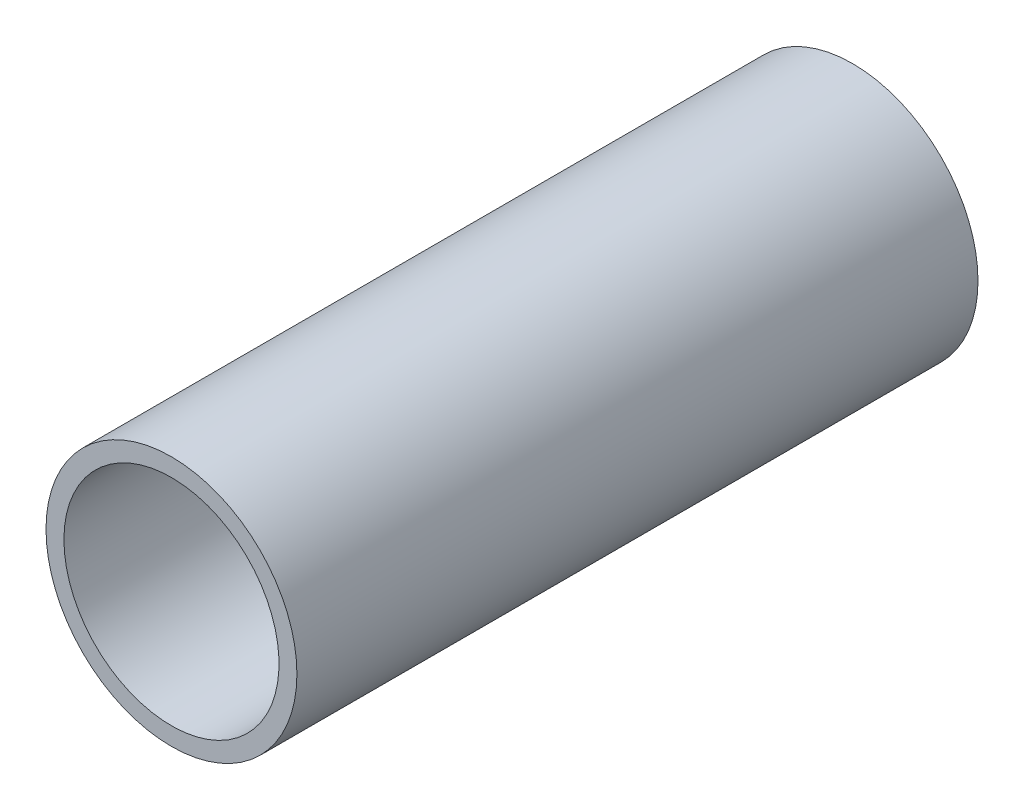
ISO-10303-21;
HEADER;
FILE_DESCRIPTION(('STEP AP214'),'2;1');
FILE_NAME('part.step','',(''),(''),'','','');
FILE_SCHEMA(('AUTOMOTIVE_DESIGN { 1 0 10303 214 1 1 1 1 }'));
ENDSEC;
DATA;
#1=APPLICATION_CONTEXT('core data for automotive mechanical design processes');
#2=APPLICATION_PROTOCOL_DEFINITION('international standard','automotive_design',2000,#1);
#3=PRODUCT_CONTEXT('',#1,'mechanical');
#4=PRODUCT('Part','Part','',(#3));
#5=PRODUCT_RELATED_PRODUCT_CATEGORY('part','',(#4));
#6=PRODUCT_DEFINITION_FORMATION('','',#4);
#7=PRODUCT_DEFINITION_CONTEXT('part definition',#1,'design');
#8=PRODUCT_DEFINITION('design','',#6,#7);
#9=PRODUCT_DEFINITION_SHAPE('','',#8);
#10=(LENGTH_UNIT() NAMED_UNIT(*) SI_UNIT(.MILLI.,.METRE.));
#11=(NAMED_UNIT(*) PLANE_ANGLE_UNIT() SI_UNIT($,.RADIAN.));
#12=(NAMED_UNIT(*) SI_UNIT($,.STERADIAN.) SOLID_ANGLE_UNIT());
#13=UNCERTAINTY_MEASURE_WITH_UNIT(LENGTH_MEASURE(1.E-05),#10,'distance_accuracy_value','');
#14=(GEOMETRIC_REPRESENTATION_CONTEXT(3) GLOBAL_UNCERTAINTY_ASSIGNED_CONTEXT((#13)) GLOBAL_UNIT_ASSIGNED_CONTEXT((#10,
#11,#12)) REPRESENTATION_CONTEXT('',''));
#15=CARTESIAN_POINT('',(0.,0.,0.));
#16=DIRECTION('',(0.,0.,1.));
#17=DIRECTION('',(1.,0.,0.));
#18=AXIS2_PLACEMENT_3D('',#15,#16,#17);
#19=CARTESIAN_POINT('',(0.,0.,30.1625));
#20=DIRECTION('',(0.,0.,1.));
#21=DIRECTION('',(1.,0.,0.));
#22=AXIS2_PLACEMENT_3D('',#19,#20,#21);
#23=PLANE('',#22);
#24=CARTESIAN_POINT('',(0.,0.,30.1625));
#25=DIRECTION('',(0.,0.,1.));
#26=DIRECTION('',(1.,0.,0.));
#27=AXIS2_PLACEMENT_3D('',#24,#25,#26);
#28=CIRCLE('',#27,5.55625);
#29=CARTESIAN_POINT('',(-5.55625,0.,30.1625));
#30=VERTEX_POINT('',#29);
#31=EDGE_CURVE('E10',#30,#30,#28,.T.);
#32=ORIENTED_EDGE('',*,*,#31,.T.);
#33=EDGE_LOOP('',(#32));
#34=FACE_BOUND('',#33,.T.);
#35=CARTESIAN_POINT('',(0.,0.,30.1625));
#36=DIRECTION('',(0.,0.,1.));
#37=DIRECTION('',(1.,0.,0.));
#38=AXIS2_PLACEMENT_3D('',#35,#36,#37);
#39=CIRCLE('',#38,4.7625);
#40=CARTESIAN_POINT('',(-4.7625,0.,30.1625));
#41=VERTEX_POINT('',#40);
#42=EDGE_CURVE('E56',#41,#41,#39,.T.);
#43=ORIENTED_EDGE('',*,*,#42,.F.);
#44=EDGE_LOOP('',(#43));
#45=FACE_BOUND('',#44,.T.);
#46=ADVANCED_FACE('F43',(#34,#45),#23,.T.);
#47=CARTESIAN_POINT('',(0.,0.,0.));
#48=DIRECTION('',(0.,0.,1.));
#49=DIRECTION('',(1.,0.,0.));
#50=AXIS2_PLACEMENT_3D('',#47,#48,#49);
#51=PLANE('',#50);
#52=CARTESIAN_POINT('',(0.,0.,0.));
#53=DIRECTION('',(0.,0.,1.));
#54=DIRECTION('',(1.,0.,0.));
#55=AXIS2_PLACEMENT_3D('',#52,#53,#54);
#56=CIRCLE('',#55,5.55625);
#57=CARTESIAN_POINT('',(-5.55625,0.,0.));
#58=VERTEX_POINT('',#57);
#59=EDGE_CURVE('E47',#58,#58,#56,.T.);
#60=ORIENTED_EDGE('',*,*,#59,.F.);
#61=EDGE_LOOP('',(#60));
#62=FACE_BOUND('',#61,.T.);
#63=CARTESIAN_POINT('',(0.,0.,0.));
#64=DIRECTION('',(0.,0.,1.));
#65=DIRECTION('',(1.,0.,0.));
#66=AXIS2_PLACEMENT_3D('',#63,#64,#65);
#67=CIRCLE('',#66,4.7625);
#68=CARTESIAN_POINT('',(-4.7625,0.,0.));
#69=VERTEX_POINT('',#68);
#70=EDGE_CURVE('E58',#69,#69,#67,.T.);
#71=ORIENTED_EDGE('',*,*,#70,.T.);
#72=EDGE_LOOP('',(#71));
#73=FACE_BOUND('',#72,.T.);
#74=ADVANCED_FACE('F70',(#62,#73),#51,.F.);
#75=CARTESIAN_POINT('',(0.,0.,30.1625));
#76=DIRECTION('',(0.,0.,-1.));
#77=DIRECTION('',(-1.,0.,0.));
#78=AXIS2_PLACEMENT_3D('',#75,#76,#77);
#79=CYLINDRICAL_SURFACE('',#78,5.55625);
#80=CARTESIAN_POINT('',(-5.55625,0.,30.1625));
#81=CARTESIAN_POINT('',(-5.55625,0.,29.8483072916667));
#82=CARTESIAN_POINT('',(-5.55625,0.,29.5341145833333));
#83=CARTESIAN_POINT('',(-5.55625,0.,28.9057291666667));
#84=CARTESIAN_POINT('',(-5.55625,0.,28.5915364583333));
#85=CARTESIAN_POINT('',(-5.55625,0.,27.9631510416667));
#86=CARTESIAN_POINT('',(-5.55625,0.,27.6489583333333));
#87=CARTESIAN_POINT('',(-5.55625,0.,27.0205729166667));
#88=CARTESIAN_POINT('',(-5.55625,0.,26.7063802083333));
#89=CARTESIAN_POINT('',(-5.55625,0.,26.0779947916667));
#90=CARTESIAN_POINT('',(-5.55625,0.,25.7638020833333));
#91=CARTESIAN_POINT('',(-5.55625,0.,25.1354166666667));
#92=CARTESIAN_POINT('',(-5.55625,0.,24.8212239583333));
#93=CARTESIAN_POINT('',(-5.55625,0.,24.1928385416667));
#94=CARTESIAN_POINT('',(-5.55625,0.,23.8786458333333));
#95=CARTESIAN_POINT('',(-5.55625,0.,23.2502604166667));
#96=CARTESIAN_POINT('',(-5.55625,0.,22.9360677083333));
#97=CARTESIAN_POINT('',(-5.55625,0.,22.3076822916667));
#98=CARTESIAN_POINT('',(-5.55625,0.,21.9934895833333));
#99=CARTESIAN_POINT('',(-5.55625,0.,21.3651041666667));
#100=CARTESIAN_POINT('',(-5.55625,0.,21.0509114583333));
#101=CARTESIAN_POINT('',(-5.55625,0.,20.4225260416667));
#102=CARTESIAN_POINT('',(-5.55625,0.,20.1083333333333));
#103=CARTESIAN_POINT('',(-5.55625,0.,19.4799479166667));
#104=CARTESIAN_POINT('',(-5.55625,0.,19.1657552083333));
#105=CARTESIAN_POINT('',(-5.55625,0.,18.5373697916667));
#106=CARTESIAN_POINT('',(-5.55625,0.,18.2231770833333));
#107=CARTESIAN_POINT('',(-5.55625,0.,17.5947916666667));
#108=CARTESIAN_POINT('',(-5.55625,0.,17.2805989583333));
#109=CARTESIAN_POINT('',(-5.55625,0.,16.6522135416667));
#110=CARTESIAN_POINT('',(-5.55625,0.,16.3380208333333));
#111=CARTESIAN_POINT('',(-5.55625,0.,15.7096354166667));
#112=CARTESIAN_POINT('',(-5.55625,0.,15.3954427083333));
#113=CARTESIAN_POINT('',(-5.55625,0.,14.7670572916667));
#114=CARTESIAN_POINT('',(-5.55625,0.,14.4528645833333));
#115=CARTESIAN_POINT('',(-5.55625,0.,13.8244791666667));
#116=CARTESIAN_POINT('',(-5.55625,0.,13.5102864583333));
#117=CARTESIAN_POINT('',(-5.55625,0.,12.8819010416667));
#118=CARTESIAN_POINT('',(-5.55625,0.,12.5677083333333));
#119=CARTESIAN_POINT('',(-5.55625,0.,11.9393229166667));
#120=CARTESIAN_POINT('',(-5.55625,0.,11.6251302083333));
#121=CARTESIAN_POINT('',(-5.55625,0.,10.9967447916667));
#122=CARTESIAN_POINT('',(-5.55625,0.,10.6825520833333));
#123=CARTESIAN_POINT('',(-5.55625,0.,10.0541666666667));
#124=CARTESIAN_POINT('',(-5.55625,0.,9.73997395833333));
#125=CARTESIAN_POINT('',(-5.55625,0.,9.11158854166667));
#126=CARTESIAN_POINT('',(-5.55625,0.,8.79739583333333));
#127=CARTESIAN_POINT('',(-5.55625,0.,8.16901041666667));
#128=CARTESIAN_POINT('',(-5.55625,0.,7.85481770833333));
#129=CARTESIAN_POINT('',(-5.55625,0.,7.22643229166667));
#130=CARTESIAN_POINT('',(-5.55625,0.,6.91223958333333));
#131=CARTESIAN_POINT('',(-5.55625,0.,6.28385416666667));
#132=CARTESIAN_POINT('',(-5.55625,0.,5.96966145833333));
#133=CARTESIAN_POINT('',(-5.55625,0.,5.34127604166667));
#134=CARTESIAN_POINT('',(-5.55625,0.,5.02708333333333));
#135=CARTESIAN_POINT('',(-5.55625,0.,4.39869791666667));
#136=CARTESIAN_POINT('',(-5.55625,0.,4.08450520833333));
#137=CARTESIAN_POINT('',(-5.55625,0.,3.45611979166667));
#138=CARTESIAN_POINT('',(-5.55625,0.,3.14192708333333));
#139=CARTESIAN_POINT('',(-5.55625,0.,2.51354166666667));
#140=CARTESIAN_POINT('',(-5.55625,0.,2.19934895833333));
#141=CARTESIAN_POINT('',(-5.55625,0.,1.57096354166667));
#142=CARTESIAN_POINT('',(-5.55625,0.,1.25677083333333));
#143=CARTESIAN_POINT('',(-5.55625,0.,0.628385416666666));
#144=CARTESIAN_POINT('',(-5.55625,0.,0.314192708333333));
#145=CARTESIAN_POINT('',(-5.55625,0.,0.));
#146=B_SPLINE_CURVE_WITH_KNOTS('',3,(#80,#81,#82,#83,#84,#85,#86,#87,#88,#89,#90,#91,#92,#93,
#94,#95,#96,#97,#98,#99,#100,#101,#102,#103,#104,#105,#106,#107,#108,#109,#110,#111,#112,#113,
#114,#115,#116,#117,#118,#119,#120,#121,#122,#123,#124,#125,#126,#127,#128,#129,#130,#131,#132,
#133,#134,#135,#136,#137,#138,#139,#140,#141,#142,#143,#144,#145),.UNSPECIFIED.,.F.,.F.,(4,2,2,
2,2,2,2,2,2,2,2,2,2,2,2,2,2,2,2,2,2,2,2,2,2,2,2,2,2,2,2,2,4),(0.,0.942578124999999,1.88515625,
2.827734375,3.7703125,4.712890625,5.65546875,6.598046875,7.540625,8.483203125,9.42578124999999,
10.368359375,11.3109375,12.253515625,13.19609375,14.138671875,15.08125,16.023828125,16.96640625,
17.908984375,18.8515625,19.794140625,20.73671875,21.679296875,22.621875,23.564453125,
24.50703125,25.449609375,26.3921875,27.334765625,28.27734375,29.219921875,30.1625),.UNSPECIFIED.);
#147=EDGE_CURVE('BSEAM45',#30,#58,#146,.T.);
#148=ORIENTED_EDGE('',*,*,#31,.F.);
#149=ORIENTED_EDGE('',*,*,#59,.T.);
#150=ORIENTED_EDGE('',*,*,#147,.T.);
#151=ORIENTED_EDGE('',*,*,#147,.F.);
#152=EDGE_LOOP('',(#148,#150,#149,#151));
#153=FACE_BOUND('',#152,.T.);
#154=ADVANCED_FACE('F45',(#153),#79,.T.);
#155=CARTESIAN_POINT('',(0.,0.,30.1625));
#156=DIRECTION('',(0.,0.,-1.));
#157=DIRECTION('',(-1.,0.,0.));
#158=AXIS2_PLACEMENT_3D('',#155,#156,#157);
#159=CYLINDRICAL_SURFACE('',#158,4.7625);
#160=CARTESIAN_POINT('',(-4.7625,0.,30.1625));
#161=CARTESIAN_POINT('',(-4.7625,0.,29.8483072916667));
#162=CARTESIAN_POINT('',(-4.7625,0.,29.5341145833333));
#163=CARTESIAN_POINT('',(-4.7625,0.,28.9057291666667));
#164=CARTESIAN_POINT('',(-4.7625,0.,28.5915364583333));
#165=CARTESIAN_POINT('',(-4.7625,0.,27.9631510416667));
#166=CARTESIAN_POINT('',(-4.7625,0.,27.6489583333333));
#167=CARTESIAN_POINT('',(-4.7625,0.,27.0205729166667));
#168=CARTESIAN_POINT('',(-4.7625,0.,26.7063802083333));
#169=CARTESIAN_POINT('',(-4.7625,0.,26.0779947916667));
#170=CARTESIAN_POINT('',(-4.7625,0.,25.7638020833333));
#171=CARTESIAN_POINT('',(-4.7625,0.,25.1354166666667));
#172=CARTESIAN_POINT('',(-4.7625,0.,24.8212239583333));
#173=CARTESIAN_POINT('',(-4.7625,0.,24.1928385416667));
#174=CARTESIAN_POINT('',(-4.7625,0.,23.8786458333333));
#175=CARTESIAN_POINT('',(-4.7625,0.,23.2502604166667));
#176=CARTESIAN_POINT('',(-4.7625,0.,22.9360677083333));
#177=CARTESIAN_POINT('',(-4.7625,0.,22.3076822916667));
#178=CARTESIAN_POINT('',(-4.7625,0.,21.9934895833333));
#179=CARTESIAN_POINT('',(-4.7625,0.,21.3651041666667));
#180=CARTESIAN_POINT('',(-4.7625,0.,21.0509114583333));
#181=CARTESIAN_POINT('',(-4.7625,0.,20.4225260416667));
#182=CARTESIAN_POINT('',(-4.7625,0.,20.1083333333333));
#183=CARTESIAN_POINT('',(-4.7625,0.,19.4799479166667));
#184=CARTESIAN_POINT('',(-4.7625,0.,19.1657552083333));
#185=CARTESIAN_POINT('',(-4.7625,0.,18.5373697916667));
#186=CARTESIAN_POINT('',(-4.7625,0.,18.2231770833333));
#187=CARTESIAN_POINT('',(-4.7625,0.,17.5947916666667));
#188=CARTESIAN_POINT('',(-4.7625,0.,17.2805989583333));
#189=CARTESIAN_POINT('',(-4.7625,0.,16.6522135416667));
#190=CARTESIAN_POINT('',(-4.7625,0.,16.3380208333333));
#191=CARTESIAN_POINT('',(-4.7625,0.,15.7096354166667));
#192=CARTESIAN_POINT('',(-4.7625,0.,15.3954427083333));
#193=CARTESIAN_POINT('',(-4.7625,0.,14.7670572916667));
#194=CARTESIAN_POINT('',(-4.7625,0.,14.4528645833333));
#195=CARTESIAN_POINT('',(-4.7625,0.,13.8244791666667));
#196=CARTESIAN_POINT('',(-4.7625,0.,13.5102864583333));
#197=CARTESIAN_POINT('',(-4.7625,0.,12.8819010416667));
#198=CARTESIAN_POINT('',(-4.7625,0.,12.5677083333333));
#199=CARTESIAN_POINT('',(-4.7625,0.,11.9393229166667));
#200=CARTESIAN_POINT('',(-4.7625,0.,11.6251302083333));
#201=CARTESIAN_POINT('',(-4.7625,0.,10.9967447916667));
#202=CARTESIAN_POINT('',(-4.7625,0.,10.6825520833333));
#203=CARTESIAN_POINT('',(-4.7625,0.,10.0541666666667));
#204=CARTESIAN_POINT('',(-4.7625,0.,9.73997395833333));
#205=CARTESIAN_POINT('',(-4.7625,0.,9.11158854166667));
#206=CARTESIAN_POINT('',(-4.7625,0.,8.79739583333333));
#207=CARTESIAN_POINT('',(-4.7625,0.,8.16901041666667));
#208=CARTESIAN_POINT('',(-4.7625,0.,7.85481770833333));
#209=CARTESIAN_POINT('',(-4.7625,0.,7.22643229166667));
#210=CARTESIAN_POINT('',(-4.7625,0.,6.91223958333333));
#211=CARTESIAN_POINT('',(-4.7625,0.,6.28385416666667));
#212=CARTESIAN_POINT('',(-4.7625,0.,5.96966145833333));
#213=CARTESIAN_POINT('',(-4.7625,0.,5.34127604166667));
#214=CARTESIAN_POINT('',(-4.7625,0.,5.02708333333333));
#215=CARTESIAN_POINT('',(-4.7625,0.,4.39869791666667));
#216=CARTESIAN_POINT('',(-4.7625,0.,4.08450520833333));
#217=CARTESIAN_POINT('',(-4.7625,0.,3.45611979166667));
#218=CARTESIAN_POINT('',(-4.7625,0.,3.14192708333333));
#219=CARTESIAN_POINT('',(-4.7625,0.,2.51354166666667));
#220=CARTESIAN_POINT('',(-4.7625,0.,2.19934895833333));
#221=CARTESIAN_POINT('',(-4.7625,0.,1.57096354166667));
#222=CARTESIAN_POINT('',(-4.7625,0.,1.25677083333333));
#223=CARTESIAN_POINT('',(-4.7625,0.,0.628385416666666));
#224=CARTESIAN_POINT('',(-4.7625,0.,0.314192708333333));
#225=CARTESIAN_POINT('',(-4.7625,0.,0.));
#226=B_SPLINE_CURVE_WITH_KNOTS('',3,(#160,#161,#162,#163,#164,#165,#166,#167,#168,#169,#170,
#171,#172,#173,#174,#175,#176,#177,#178,#179,#180,#181,#182,#183,#184,#185,#186,#187,#188,#189,
#190,#191,#192,#193,#194,#195,#196,#197,#198,#199,#200,#201,#202,#203,#204,#205,#206,#207,#208,
#209,#210,#211,#212,#213,#214,#215,#216,#217,#218,#219,#220,#221,#222,#223,#224,#225),
.UNSPECIFIED.,.F.,.F.,(4,2,2,2,2,2,2,2,2,2,2,2,2,2,2,2,2,2,2,2,2,2,2,2,2,2,2,2,2,2,2,2,4),(0.,
0.942578124999999,1.88515625,2.827734375,3.7703125,4.712890625,5.65546875,6.598046875,7.540625,
8.483203125,9.42578124999999,10.368359375,11.3109375,12.253515625,13.19609375,14.138671875,
15.08125,16.023828125,16.96640625,17.908984375,18.8515625,19.794140625,20.73671875,21.679296875,
22.621875,23.564453125,24.50703125,25.449609375,26.3921875,27.334765625,28.27734375,
29.219921875,30.1625),.UNSPECIFIED.);
#227=EDGE_CURVE('BSEAM66',#41,#69,#226,.T.);
#228=ORIENTED_EDGE('',*,*,#42,.T.);
#229=ORIENTED_EDGE('',*,*,#70,.F.);
#230=ORIENTED_EDGE('',*,*,#227,.T.);
#231=ORIENTED_EDGE('',*,*,#227,.F.);
#232=EDGE_LOOP('',(#228,#230,#229,#231));
#233=FACE_BOUND('',#232,.T.);
#234=ADVANCED_FACE('F66',(#233),#159,.F.);
#235=CLOSED_SHELL('',(#46,#74,#154,#234));
#236=MANIFOLD_SOLID_BREP('B2',#235);
#237=ADVANCED_BREP_SHAPE_REPRESENTATION('',(#18,#236),#14);
#238=SHAPE_DEFINITION_REPRESENTATION(#9,#237);
ENDSEC;
END-ISO-10303-21;
